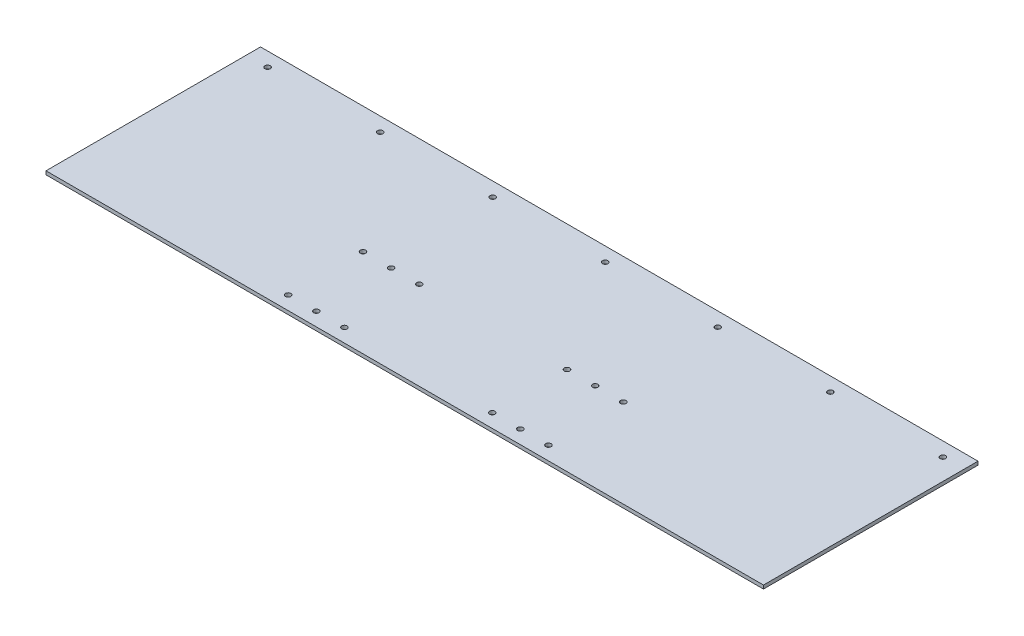
ISO-10303-21;
HEADER;
FILE_DESCRIPTION(('STEP AP214'),'2;1');
FILE_NAME('part.step','',(''),(''),'','','');
FILE_SCHEMA(('AUTOMOTIVE_DESIGN { 1 0 10303 214 1 1 1 1 }'));
ENDSEC;
DATA;
#1=APPLICATION_CONTEXT('core data for automotive mechanical design processes');
#2=APPLICATION_PROTOCOL_DEFINITION('international standard','automotive_design',2000,#1);
#3=PRODUCT_CONTEXT('',#1,'mechanical');
#4=PRODUCT('Part','Part','',(#3));
#5=PRODUCT_RELATED_PRODUCT_CATEGORY('part','',(#4));
#6=PRODUCT_DEFINITION_FORMATION('','',#4);
#7=PRODUCT_DEFINITION_CONTEXT('part definition',#1,'design');
#8=PRODUCT_DEFINITION('design','',#6,#7);
#9=PRODUCT_DEFINITION_SHAPE('','',#8);
#10=(LENGTH_UNIT() NAMED_UNIT(*) SI_UNIT(.MILLI.,.METRE.));
#11=(NAMED_UNIT(*) PLANE_ANGLE_UNIT() SI_UNIT($,.RADIAN.));
#12=(NAMED_UNIT(*) SI_UNIT($,.STERADIAN.) SOLID_ANGLE_UNIT());
#13=UNCERTAINTY_MEASURE_WITH_UNIT(LENGTH_MEASURE(1.E-05),#10,'distance_accuracy_value','');
#14=(GEOMETRIC_REPRESENTATION_CONTEXT(3) GLOBAL_UNCERTAINTY_ASSIGNED_CONTEXT((#13)) GLOBAL_UNIT_ASSIGNED_CONTEXT((#10,
#11,#12)) REPRESENTATION_CONTEXT('',''));
#15=CARTESIAN_POINT('',(0.,0.,0.));
#16=DIRECTION('',(0.,0.,1.));
#17=DIRECTION('',(1.,0.,0.));
#18=AXIS2_PLACEMENT_3D('',#15,#16,#17);
#19=CARTESIAN_POINT('',(0.,3.175,0.));
#20=DIRECTION('',(0.,-1.,0.));
#21=DIRECTION('',(0.,0.,-1.));
#22=AXIS2_PLACEMENT_3D('',#19,#20,#21);
#23=PLANE('',#22);
#24=DIRECTION('',(0.,0.,1.));
#25=VECTOR('',#24,1.);
#26=CARTESIAN_POINT('',(0.,3.175,0.));
#27=LINE('',#26,#25);
#28=CARTESIAN_POINT('',(0.,3.175,-193.675));
#29=VERTEX_POINT('',#28);
#30=CARTESIAN_POINT('',(0.,3.175,0.));
#31=VERTEX_POINT('',#30);
#32=EDGE_CURVE('E85',#29,#31,#27,.T.);
#33=ORIENTED_EDGE('',*,*,#32,.T.);
#34=DIRECTION('',(1.,0.,0.));
#35=VECTOR('',#34,1.);
#36=CARTESIAN_POINT('',(0.,3.175,0.));
#37=LINE('',#36,#35);
#38=CARTESIAN_POINT('',(647.7,3.175,0.));
#39=VERTEX_POINT('',#38);
#40=EDGE_CURVE('E80',#31,#39,#37,.T.);
#41=ORIENTED_EDGE('',*,*,#40,.T.);
#42=DIRECTION('',(0.,0.,-1.));
#43=VECTOR('',#42,1.);
#44=CARTESIAN_POINT('',(647.7,3.175,0.));
#45=LINE('',#44,#43);
#46=CARTESIAN_POINT('',(647.7,3.175,-193.675));
#47=VERTEX_POINT('',#46);
#48=EDGE_CURVE('E83',#39,#47,#45,.T.);
#49=ORIENTED_EDGE('',*,*,#48,.T.);
#50=DIRECTION('',(-1.,0.,0.));
#51=VECTOR('',#50,1.);
#52=CARTESIAN_POINT('',(0.,3.175,-193.675));
#53=LINE('',#52,#51);
#54=EDGE_CURVE('E50',#47,#29,#53,.T.);
#55=ORIENTED_EDGE('',*,*,#54,.T.);
#56=EDGE_LOOP('',(#33,#41,#49,#55));
#57=FACE_BOUND('',#56,.T.);
#58=CARTESIAN_POINT('',(231.775,3.175,-12.2555));
#59=DIRECTION('',(0.,1.,0.));
#60=DIRECTION('',(0.,0.,1.));
#61=AXIS2_PLACEMENT_3D('',#58,#59,#60);
#62=CIRCLE('',#61,2.4257);
#63=CARTESIAN_POINT('',(231.775,3.175,-9.8298));
#64=VERTEX_POINT('',#63);
#65=EDGE_CURVE('E100',#64,#64,#62,.T.);
#66=ORIENTED_EDGE('',*,*,#65,.F.);
#67=EDGE_LOOP('',(#66));
#68=FACE_BOUND('',#67,.T.);
#69=CARTESIAN_POINT('',(257.175,3.175,-12.2555));
#70=DIRECTION('',(0.,1.,0.));
#71=DIRECTION('',(0.,0.,1.));
#72=AXIS2_PLACEMENT_3D('',#69,#70,#71);
#73=CIRCLE('',#72,2.42569999999997);
#74=CARTESIAN_POINT('',(257.175,3.175,-9.82980000000003));
#75=VERTEX_POINT('',#74);
#76=EDGE_CURVE('E115',#75,#75,#73,.T.);
#77=ORIENTED_EDGE('',*,*,#76,.F.);
#78=EDGE_LOOP('',(#77));
#79=FACE_BOUND('',#78,.T.);
#80=CARTESIAN_POINT('',(206.375,3.175,-12.2555));
#81=DIRECTION('',(0.,1.,0.));
#82=DIRECTION('',(0.,0.,-1.));
#83=AXIS2_PLACEMENT_3D('',#80,#81,#82);
#84=CIRCLE('',#83,2.42569999999997);
#85=CARTESIAN_POINT('',(206.375,3.175,-14.6812));
#86=VERTEX_POINT('',#85);
#87=EDGE_CURVE('E121',#86,#86,#84,.T.);
#88=ORIENTED_EDGE('',*,*,#87,.F.);
#89=EDGE_LOOP('',(#88));
#90=FACE_BOUND('',#89,.T.);
#91=CARTESIAN_POINT('',(257.175,3.175,-79.8195));
#92=DIRECTION('',(0.,1.,0.));
#93=DIRECTION('',(0.,0.,-1.));
#94=AXIS2_PLACEMENT_3D('',#91,#92,#93);
#95=CIRCLE('',#94,2.42569999999997);
#96=CARTESIAN_POINT('',(257.175,3.175,-82.2452));
#97=VERTEX_POINT('',#96);
#98=EDGE_CURVE('E127',#97,#97,#95,.T.);
#99=ORIENTED_EDGE('',*,*,#98,.F.);
#100=EDGE_LOOP('',(#99));
#101=FACE_BOUND('',#100,.T.);
#102=CARTESIAN_POINT('',(231.775,3.175,-79.8195));
#103=DIRECTION('',(0.,1.,0.));
#104=DIRECTION('',(0.,0.,-1.));
#105=AXIS2_PLACEMENT_3D('',#102,#103,#104);
#106=CIRCLE('',#105,2.4257);
#107=CARTESIAN_POINT('',(231.775,3.175,-82.2452));
#108=VERTEX_POINT('',#107);
#109=EDGE_CURVE('E133',#108,#108,#106,.T.);
#110=ORIENTED_EDGE('',*,*,#109,.F.);
#111=EDGE_LOOP('',(#110));
#112=FACE_BOUND('',#111,.T.);
#113=CARTESIAN_POINT('',(206.375,3.175,-79.8195));
#114=DIRECTION('',(0.,1.,0.));
#115=DIRECTION('',(0.,0.,1.));
#116=AXIS2_PLACEMENT_3D('',#113,#114,#115);
#117=CIRCLE('',#116,2.42569999999997);
#118=CARTESIAN_POINT('',(206.375,3.175,-77.3938));
#119=VERTEX_POINT('',#118);
#120=EDGE_CURVE('E139',#119,#119,#117,.T.);
#121=ORIENTED_EDGE('',*,*,#120,.F.);
#122=EDGE_LOOP('',(#121));
#123=FACE_BOUND('',#122,.T.);
#124=CARTESIAN_POINT('',(323.85,3.175,-180.975));
#125=DIRECTION('',(0.,1.,0.));
#126=DIRECTION('',(0.,0.,1.));
#127=AXIS2_PLACEMENT_3D('',#124,#125,#126);
#128=CIRCLE('',#127,2.42569999999997);
#129=CARTESIAN_POINT('',(323.85,3.175,-178.5493));
#130=VERTEX_POINT('',#129);
#131=EDGE_CURVE('E145',#130,#130,#128,.T.);
#132=ORIENTED_EDGE('',*,*,#131,.F.);
#133=EDGE_LOOP('',(#132));
#134=FACE_BOUND('',#133,.T.);
#135=CARTESIAN_POINT('',(425.45,3.175,-180.975));
#136=DIRECTION('',(0.,1.,0.));
#137=DIRECTION('',(0.,0.,1.));
#138=AXIS2_PLACEMENT_3D('',#135,#136,#137);
#139=CIRCLE('',#138,2.42569999999997);
#140=CARTESIAN_POINT('',(425.45,3.175,-178.5493));
#141=VERTEX_POINT('',#140);
#142=EDGE_CURVE('E151',#141,#141,#139,.T.);
#143=ORIENTED_EDGE('',*,*,#142,.F.);
#144=EDGE_LOOP('',(#143));
#145=FACE_BOUND('',#144,.T.);
#146=CARTESIAN_POINT('',(527.05,3.175,-180.975));
#147=DIRECTION('',(0.,1.,0.));
#148=DIRECTION('',(0.,0.,1.));
#149=AXIS2_PLACEMENT_3D('',#146,#147,#148);
#150=CIRCLE('',#149,2.42569999999997);
#151=CARTESIAN_POINT('',(527.05,3.175,-178.5493));
#152=VERTEX_POINT('',#151);
#153=EDGE_CURVE('E157',#152,#152,#150,.T.);
#154=ORIENTED_EDGE('',*,*,#153,.F.);
#155=EDGE_LOOP('',(#154));
#156=FACE_BOUND('',#155,.T.);
#157=CARTESIAN_POINT('',(628.65,3.175,-180.975));
#158=DIRECTION('',(0.,1.,0.));
#159=DIRECTION('',(0.,0.,1.));
#160=AXIS2_PLACEMENT_3D('',#157,#158,#159);
#161=CIRCLE('',#160,2.42569999999997);
#162=CARTESIAN_POINT('',(628.65,3.175,-178.5493));
#163=VERTEX_POINT('',#162);
#164=EDGE_CURVE('E163',#163,#163,#161,.T.);
#165=ORIENTED_EDGE('',*,*,#164,.F.);
#166=EDGE_LOOP('',(#165));
#167=FACE_BOUND('',#166,.T.);
#168=CARTESIAN_POINT('',(120.65,3.175,-180.975));
#169=DIRECTION('',(0.,1.,0.));
#170=DIRECTION('',(0.,0.,-1.));
#171=AXIS2_PLACEMENT_3D('',#168,#169,#170);
#172=CIRCLE('',#171,2.42569999999998);
#173=CARTESIAN_POINT('',(120.65,3.175,-183.4007));
#174=VERTEX_POINT('',#173);
#175=EDGE_CURVE('E169',#174,#174,#172,.T.);
#176=ORIENTED_EDGE('',*,*,#175,.F.);
#177=EDGE_LOOP('',(#176));
#178=FACE_BOUND('',#177,.T.);
#179=CARTESIAN_POINT('',(222.25,3.175,-180.975));
#180=DIRECTION('',(0.,1.,0.));
#181=DIRECTION('',(0.,0.,-1.));
#182=AXIS2_PLACEMENT_3D('',#179,#180,#181);
#183=CIRCLE('',#182,2.42569999999997);
#184=CARTESIAN_POINT('',(222.25,3.175,-183.4007));
#185=VERTEX_POINT('',#184);
#186=EDGE_CURVE('E175',#185,#185,#183,.T.);
#187=ORIENTED_EDGE('',*,*,#186,.F.);
#188=EDGE_LOOP('',(#187));
#189=FACE_BOUND('',#188,.T.);
#190=CARTESIAN_POINT('',(19.05,3.175,-180.975));
#191=DIRECTION('',(0.,1.,0.));
#192=DIRECTION('',(0.,0.,-1.));
#193=AXIS2_PLACEMENT_3D('',#190,#191,#192);
#194=CIRCLE('',#193,2.42569999999997);
#195=CARTESIAN_POINT('',(19.05,3.175,-183.4007));
#196=VERTEX_POINT('',#195);
#197=EDGE_CURVE('E181',#196,#196,#194,.T.);
#198=ORIENTED_EDGE('',*,*,#197,.F.);
#199=EDGE_LOOP('',(#198));
#200=FACE_BOUND('',#199,.T.);
#201=CARTESIAN_POINT('',(441.325,3.175,-79.8195));
#202=DIRECTION('',(0.,1.,0.));
#203=DIRECTION('',(0.,0.,-1.));
#204=AXIS2_PLACEMENT_3D('',#201,#202,#203);
#205=CIRCLE('',#204,2.42569999999997);
#206=CARTESIAN_POINT('',(441.325,3.175,-82.2452));
#207=VERTEX_POINT('',#206);
#208=EDGE_CURVE('E187',#207,#207,#205,.T.);
#209=ORIENTED_EDGE('',*,*,#208,.F.);
#210=EDGE_LOOP('',(#209));
#211=FACE_BOUND('',#210,.T.);
#212=CARTESIAN_POINT('',(415.925,3.175,-79.8195));
#213=DIRECTION('',(0.,1.,0.));
#214=DIRECTION('',(0.,0.,1.));
#215=AXIS2_PLACEMENT_3D('',#212,#213,#214);
#216=CIRCLE('',#215,2.42569999999997);
#217=CARTESIAN_POINT('',(415.925,3.175,-77.3938));
#218=VERTEX_POINT('',#217);
#219=EDGE_CURVE('E193',#218,#218,#216,.T.);
#220=ORIENTED_EDGE('',*,*,#219,.F.);
#221=EDGE_LOOP('',(#220));
#222=FACE_BOUND('',#221,.T.);
#223=CARTESIAN_POINT('',(390.525,3.175,-79.8195));
#224=DIRECTION('',(0.,1.,0.));
#225=DIRECTION('',(0.,0.,1.));
#226=AXIS2_PLACEMENT_3D('',#223,#224,#225);
#227=CIRCLE('',#226,2.42569999999997);
#228=CARTESIAN_POINT('',(390.525,3.175,-77.3938));
#229=VERTEX_POINT('',#228);
#230=EDGE_CURVE('E199',#229,#229,#227,.T.);
#231=ORIENTED_EDGE('',*,*,#230,.F.);
#232=EDGE_LOOP('',(#231));
#233=FACE_BOUND('',#232,.T.);
#234=CARTESIAN_POINT('',(441.325,3.175,-12.2555));
#235=DIRECTION('',(0.,1.,0.));
#236=DIRECTION('',(0.,0.,1.));
#237=AXIS2_PLACEMENT_3D('',#234,#235,#236);
#238=CIRCLE('',#237,2.42569999999997);
#239=CARTESIAN_POINT('',(441.325,3.175,-9.82980000000003));
#240=VERTEX_POINT('',#239);
#241=EDGE_CURVE('E205',#240,#240,#238,.T.);
#242=ORIENTED_EDGE('',*,*,#241,.F.);
#243=EDGE_LOOP('',(#242));
#244=FACE_BOUND('',#243,.T.);
#245=CARTESIAN_POINT('',(390.525,3.175,-12.2555));
#246=DIRECTION('',(0.,1.,0.));
#247=DIRECTION('',(0.,0.,-1.));
#248=AXIS2_PLACEMENT_3D('',#245,#246,#247);
#249=CIRCLE('',#248,2.42569999999997);
#250=CARTESIAN_POINT('',(390.525,3.175,-14.6812));
#251=VERTEX_POINT('',#250);
#252=EDGE_CURVE('E211',#251,#251,#249,.T.);
#253=ORIENTED_EDGE('',*,*,#252,.F.);
#254=EDGE_LOOP('',(#253));
#255=FACE_BOUND('',#254,.T.);
#256=CARTESIAN_POINT('',(415.925,3.175,-12.2555));
#257=DIRECTION('',(0.,1.,0.));
#258=DIRECTION('',(0.,0.,-1.));
#259=AXIS2_PLACEMENT_3D('',#256,#257,#258);
#260=CIRCLE('',#259,2.42569999999997);
#261=CARTESIAN_POINT('',(415.925,3.175,-14.6812));
#262=VERTEX_POINT('',#261);
#263=EDGE_CURVE('E217',#262,#262,#260,.T.);
#264=ORIENTED_EDGE('',*,*,#263,.F.);
#265=EDGE_LOOP('',(#264));
#266=FACE_BOUND('',#265,.T.);
#267=ADVANCED_FACE('F33',(#57,#68,#79,#90,#101,#112,#123,#134,#145,#156,#167,#178,#189,#200,
#211,#222,#233,#244,#255,#266),#23,.F.);
#268=CARTESIAN_POINT('',(0.,0.,0.));
#269=DIRECTION('',(0.,-1.,0.));
#270=DIRECTION('',(0.,0.,-1.));
#271=AXIS2_PLACEMENT_3D('',#268,#269,#270);
#272=PLANE('',#271);
#273=CARTESIAN_POINT('',(390.525,0.,-12.2555));
#274=DIRECTION('',(0.,1.,0.));
#275=DIRECTION('',(0.,0.,-1.));
#276=AXIS2_PLACEMENT_3D('',#273,#274,#275);
#277=CIRCLE('',#276,2.42569999999997);
#278=CARTESIAN_POINT('',(390.525,0.,-14.6812));
#279=VERTEX_POINT('',#278);
#280=EDGE_CURVE('E214',#279,#279,#277,.T.);
#281=ORIENTED_EDGE('',*,*,#280,.T.);
#282=EDGE_LOOP('',(#281));
#283=FACE_BOUND('',#282,.T.);
#284=CARTESIAN_POINT('',(390.525,0.,-79.8195));
#285=DIRECTION('',(0.,1.,0.));
#286=DIRECTION('',(0.,0.,1.));
#287=AXIS2_PLACEMENT_3D('',#284,#285,#286);
#288=CIRCLE('',#287,2.42569999999997);
#289=CARTESIAN_POINT('',(390.525,0.,-77.3938));
#290=VERTEX_POINT('',#289);
#291=EDGE_CURVE('E202',#290,#290,#288,.T.);
#292=ORIENTED_EDGE('',*,*,#291,.T.);
#293=EDGE_LOOP('',(#292));
#294=FACE_BOUND('',#293,.T.);
#295=CARTESIAN_POINT('',(441.325,0.,-79.8195));
#296=DIRECTION('',(0.,1.,0.));
#297=DIRECTION('',(0.,0.,-1.));
#298=AXIS2_PLACEMENT_3D('',#295,#296,#297);
#299=CIRCLE('',#298,2.42569999999997);
#300=CARTESIAN_POINT('',(441.325,0.,-82.2452));
#301=VERTEX_POINT('',#300);
#302=EDGE_CURVE('E190',#301,#301,#299,.T.);
#303=ORIENTED_EDGE('',*,*,#302,.T.);
#304=EDGE_LOOP('',(#303));
#305=FACE_BOUND('',#304,.T.);
#306=CARTESIAN_POINT('',(222.25,0.,-180.975));
#307=DIRECTION('',(0.,1.,0.));
#308=DIRECTION('',(0.,0.,-1.));
#309=AXIS2_PLACEMENT_3D('',#306,#307,#308);
#310=CIRCLE('',#309,2.42569999999997);
#311=CARTESIAN_POINT('',(222.25,0.,-183.4007));
#312=VERTEX_POINT('',#311);
#313=EDGE_CURVE('E178',#312,#312,#310,.T.);
#314=ORIENTED_EDGE('',*,*,#313,.T.);
#315=EDGE_LOOP('',(#314));
#316=FACE_BOUND('',#315,.T.);
#317=CARTESIAN_POINT('',(628.65,0.,-180.975));
#318=DIRECTION('',(0.,1.,0.));
#319=DIRECTION('',(0.,0.,1.));
#320=AXIS2_PLACEMENT_3D('',#317,#318,#319);
#321=CIRCLE('',#320,2.42569999999997);
#322=CARTESIAN_POINT('',(628.65,0.,-178.5493));
#323=VERTEX_POINT('',#322);
#324=EDGE_CURVE('E166',#323,#323,#321,.T.);
#325=ORIENTED_EDGE('',*,*,#324,.T.);
#326=EDGE_LOOP('',(#325));
#327=FACE_BOUND('',#326,.T.);
#328=CARTESIAN_POINT('',(425.45,0.,-180.975));
#329=DIRECTION('',(0.,1.,0.));
#330=DIRECTION('',(0.,0.,1.));
#331=AXIS2_PLACEMENT_3D('',#328,#329,#330);
#332=CIRCLE('',#331,2.42569999999997);
#333=CARTESIAN_POINT('',(425.45,0.,-178.5493));
#334=VERTEX_POINT('',#333);
#335=EDGE_CURVE('E154',#334,#334,#332,.T.);
#336=ORIENTED_EDGE('',*,*,#335,.T.);
#337=EDGE_LOOP('',(#336));
#338=FACE_BOUND('',#337,.T.);
#339=CARTESIAN_POINT('',(206.375,0.,-79.8195));
#340=DIRECTION('',(0.,1.,0.));
#341=DIRECTION('',(0.,0.,1.));
#342=AXIS2_PLACEMENT_3D('',#339,#340,#341);
#343=CIRCLE('',#342,2.42569999999997);
#344=CARTESIAN_POINT('',(206.375,0.,-77.3938));
#345=VERTEX_POINT('',#344);
#346=EDGE_CURVE('E142',#345,#345,#343,.T.);
#347=ORIENTED_EDGE('',*,*,#346,.T.);
#348=EDGE_LOOP('',(#347));
#349=FACE_BOUND('',#348,.T.);
#350=CARTESIAN_POINT('',(257.175,0.,-79.8195));
#351=DIRECTION('',(0.,1.,0.));
#352=DIRECTION('',(0.,0.,-1.));
#353=AXIS2_PLACEMENT_3D('',#350,#351,#352);
#354=CIRCLE('',#353,2.42569999999997);
#355=CARTESIAN_POINT('',(257.175,0.,-82.2452));
#356=VERTEX_POINT('',#355);
#357=EDGE_CURVE('E130',#356,#356,#354,.T.);
#358=ORIENTED_EDGE('',*,*,#357,.T.);
#359=EDGE_LOOP('',(#358));
#360=FACE_BOUND('',#359,.T.);
#361=CARTESIAN_POINT('',(257.175,0.,-12.2555));
#362=DIRECTION('',(0.,1.,0.));
#363=DIRECTION('',(0.,0.,1.));
#364=AXIS2_PLACEMENT_3D('',#361,#362,#363);
#365=CIRCLE('',#364,2.42569999999997);
#366=CARTESIAN_POINT('',(257.175,0.,-9.82980000000003));
#367=VERTEX_POINT('',#366);
#368=EDGE_CURVE('E118',#367,#367,#365,.T.);
#369=ORIENTED_EDGE('',*,*,#368,.T.);
#370=EDGE_LOOP('',(#369));
#371=FACE_BOUND('',#370,.T.);
#372=DIRECTION('',(0.,0.,1.));
#373=VECTOR('',#372,1.);
#374=CARTESIAN_POINT('',(0.,0.,0.));
#375=LINE('',#374,#373);
#376=CARTESIAN_POINT('',(0.,0.,-193.675));
#377=VERTEX_POINT('',#376);
#378=CARTESIAN_POINT('',(0.,0.,0.));
#379=VERTEX_POINT('',#378);
#380=EDGE_CURVE('E97',#377,#379,#375,.T.);
#381=ORIENTED_EDGE('',*,*,#380,.F.);
#382=DIRECTION('',(-1.,0.,0.));
#383=VECTOR('',#382,1.);
#384=CARTESIAN_POINT('',(0.,0.,-193.675));
#385=LINE('',#384,#383);
#386=CARTESIAN_POINT('',(647.7,0.,-193.675));
#387=VERTEX_POINT('',#386);
#388=EDGE_CURVE('E73',#387,#377,#385,.T.);
#389=ORIENTED_EDGE('',*,*,#388,.F.);
#390=DIRECTION('',(0.,0.,-1.));
#391=VECTOR('',#390,1.);
#392=CARTESIAN_POINT('',(647.7,0.,0.));
#393=LINE('',#392,#391);
#394=CARTESIAN_POINT('',(647.7,0.,0.));
#395=VERTEX_POINT('',#394);
#396=EDGE_CURVE('E67',#395,#387,#393,.T.);
#397=ORIENTED_EDGE('',*,*,#396,.F.);
#398=DIRECTION('',(1.,0.,0.));
#399=VECTOR('',#398,1.);
#400=CARTESIAN_POINT('',(0.,0.,0.));
#401=LINE('',#400,#399);
#402=EDGE_CURVE('E89',#379,#395,#401,.T.);
#403=ORIENTED_EDGE('',*,*,#402,.F.);
#404=EDGE_LOOP('',(#381,#389,#397,#403));
#405=FACE_BOUND('',#404,.T.);
#406=CARTESIAN_POINT('',(231.775,0.,-12.2555));
#407=DIRECTION('',(0.,1.,0.));
#408=DIRECTION('',(0.,0.,1.));
#409=AXIS2_PLACEMENT_3D('',#406,#407,#408);
#410=CIRCLE('',#409,2.4257);
#411=CARTESIAN_POINT('',(231.775,0.,-9.8298));
#412=VERTEX_POINT('',#411);
#413=EDGE_CURVE('E112',#412,#412,#410,.T.);
#414=ORIENTED_EDGE('',*,*,#413,.T.);
#415=EDGE_LOOP('',(#414));
#416=FACE_BOUND('',#415,.T.);
#417=CARTESIAN_POINT('',(206.375,0.,-12.2555));
#418=DIRECTION('',(0.,1.,0.));
#419=DIRECTION('',(0.,0.,-1.));
#420=AXIS2_PLACEMENT_3D('',#417,#418,#419);
#421=CIRCLE('',#420,2.42569999999997);
#422=CARTESIAN_POINT('',(206.375,0.,-14.6812));
#423=VERTEX_POINT('',#422);
#424=EDGE_CURVE('E124',#423,#423,#421,.T.);
#425=ORIENTED_EDGE('',*,*,#424,.T.);
#426=EDGE_LOOP('',(#425));
#427=FACE_BOUND('',#426,.T.);
#428=CARTESIAN_POINT('',(231.775,0.,-79.8195));
#429=DIRECTION('',(0.,1.,0.));
#430=DIRECTION('',(0.,0.,-1.));
#431=AXIS2_PLACEMENT_3D('',#428,#429,#430);
#432=CIRCLE('',#431,2.4257);
#433=CARTESIAN_POINT('',(231.775,0.,-82.2452));
#434=VERTEX_POINT('',#433);
#435=EDGE_CURVE('E136',#434,#434,#432,.T.);
#436=ORIENTED_EDGE('',*,*,#435,.T.);
#437=EDGE_LOOP('',(#436));
#438=FACE_BOUND('',#437,.T.);
#439=CARTESIAN_POINT('',(323.85,0.,-180.975));
#440=DIRECTION('',(0.,1.,0.));
#441=DIRECTION('',(0.,0.,1.));
#442=AXIS2_PLACEMENT_3D('',#439,#440,#441);
#443=CIRCLE('',#442,2.42569999999997);
#444=CARTESIAN_POINT('',(323.85,0.,-178.5493));
#445=VERTEX_POINT('',#444);
#446=EDGE_CURVE('E148',#445,#445,#443,.T.);
#447=ORIENTED_EDGE('',*,*,#446,.T.);
#448=EDGE_LOOP('',(#447));
#449=FACE_BOUND('',#448,.T.);
#450=CARTESIAN_POINT('',(527.05,0.,-180.975));
#451=DIRECTION('',(0.,1.,0.));
#452=DIRECTION('',(0.,0.,1.));
#453=AXIS2_PLACEMENT_3D('',#450,#451,#452);
#454=CIRCLE('',#453,2.42569999999997);
#455=CARTESIAN_POINT('',(527.05,0.,-178.5493));
#456=VERTEX_POINT('',#455);
#457=EDGE_CURVE('E160',#456,#456,#454,.T.);
#458=ORIENTED_EDGE('',*,*,#457,.T.);
#459=EDGE_LOOP('',(#458));
#460=FACE_BOUND('',#459,.T.);
#461=CARTESIAN_POINT('',(120.65,0.,-180.975));
#462=DIRECTION('',(0.,1.,0.));
#463=DIRECTION('',(0.,0.,-1.));
#464=AXIS2_PLACEMENT_3D('',#461,#462,#463);
#465=CIRCLE('',#464,2.42569999999998);
#466=CARTESIAN_POINT('',(120.65,0.,-183.4007));
#467=VERTEX_POINT('',#466);
#468=EDGE_CURVE('E172',#467,#467,#465,.T.);
#469=ORIENTED_EDGE('',*,*,#468,.T.);
#470=EDGE_LOOP('',(#469));
#471=FACE_BOUND('',#470,.T.);
#472=CARTESIAN_POINT('',(19.05,0.,-180.975));
#473=DIRECTION('',(0.,1.,0.));
#474=DIRECTION('',(0.,0.,-1.));
#475=AXIS2_PLACEMENT_3D('',#472,#473,#474);
#476=CIRCLE('',#475,2.42569999999997);
#477=CARTESIAN_POINT('',(19.05,0.,-183.4007));
#478=VERTEX_POINT('',#477);
#479=EDGE_CURVE('E184',#478,#478,#476,.T.);
#480=ORIENTED_EDGE('',*,*,#479,.T.);
#481=EDGE_LOOP('',(#480));
#482=FACE_BOUND('',#481,.T.);
#483=CARTESIAN_POINT('',(415.925,0.,-79.8195));
#484=DIRECTION('',(0.,1.,0.));
#485=DIRECTION('',(0.,0.,1.));
#486=AXIS2_PLACEMENT_3D('',#483,#484,#485);
#487=CIRCLE('',#486,2.42569999999997);
#488=CARTESIAN_POINT('',(415.925,0.,-77.3938));
#489=VERTEX_POINT('',#488);
#490=EDGE_CURVE('E196',#489,#489,#487,.T.);
#491=ORIENTED_EDGE('',*,*,#490,.T.);
#492=EDGE_LOOP('',(#491));
#493=FACE_BOUND('',#492,.T.);
#494=CARTESIAN_POINT('',(441.325,0.,-12.2555));
#495=DIRECTION('',(0.,1.,0.));
#496=DIRECTION('',(0.,0.,1.));
#497=AXIS2_PLACEMENT_3D('',#494,#495,#496);
#498=CIRCLE('',#497,2.42569999999997);
#499=CARTESIAN_POINT('',(441.325,0.,-9.82980000000003));
#500=VERTEX_POINT('',#499);
#501=EDGE_CURVE('E208',#500,#500,#498,.T.);
#502=ORIENTED_EDGE('',*,*,#501,.T.);
#503=EDGE_LOOP('',(#502));
#504=FACE_BOUND('',#503,.T.);
#505=CARTESIAN_POINT('',(415.925,0.,-12.2555));
#506=DIRECTION('',(0.,1.,0.));
#507=DIRECTION('',(0.,0.,-1.));
#508=AXIS2_PLACEMENT_3D('',#505,#506,#507);
#509=CIRCLE('',#508,2.42569999999997);
#510=CARTESIAN_POINT('',(415.925,0.,-14.6812));
#511=VERTEX_POINT('',#510);
#512=EDGE_CURVE('E220',#511,#511,#509,.T.);
#513=ORIENTED_EDGE('',*,*,#512,.T.);
#514=EDGE_LOOP('',(#513));
#515=FACE_BOUND('',#514,.T.);
#516=ADVANCED_FACE('F108',(#283,#294,#305,#316,#327,#338,#349,#360,#371,#405,#416,#427,#438,
#449,#460,#471,#482,#493,#504,#515),#272,.T.);
#517=CARTESIAN_POINT('',(0.,3.175,0.));
#518=DIRECTION('',(1.,0.,0.));
#519=DIRECTION('',(0.,0.,-1.));
#520=AXIS2_PLACEMENT_3D('',#517,#518,#519);
#521=PLANE('',#520);
#522=ORIENTED_EDGE('',*,*,#380,.T.);
#523=DIRECTION('',(0.,-1.,0.));
#524=VECTOR('',#523,1.);
#525=CARTESIAN_POINT('',(0.,3.175,0.));
#526=LINE('',#525,#524);
#527=EDGE_CURVE('E11',#31,#379,#526,.T.);
#528=ORIENTED_EDGE('',*,*,#527,.F.);
#529=ORIENTED_EDGE('',*,*,#32,.F.);
#530=DIRECTION('',(0.,-1.,0.));
#531=VECTOR('',#530,1.);
#532=CARTESIAN_POINT('',(0.,3.175,-193.675));
#533=LINE('',#532,#531);
#534=EDGE_CURVE('E93',#29,#377,#533,.T.);
#535=ORIENTED_EDGE('',*,*,#534,.T.);
#536=EDGE_LOOP('',(#522,#528,#529,#535));
#537=FACE_BOUND('',#536,.T.);
#538=ADVANCED_FACE('F35',(#537),#521,.F.);
#539=CARTESIAN_POINT('',(0.,3.175,0.));
#540=DIRECTION('',(0.,0.,-1.));
#541=DIRECTION('',(-1.,0.,0.));
#542=AXIS2_PLACEMENT_3D('',#539,#540,#541);
#543=PLANE('',#542);
#544=ORIENTED_EDGE('',*,*,#402,.T.);
#545=DIRECTION('',(0.,-1.,0.));
#546=VECTOR('',#545,1.);
#547=CARTESIAN_POINT('',(647.7,3.175,0.));
#548=LINE('',#547,#546);
#549=EDGE_CURVE('E42',#39,#395,#548,.T.);
#550=ORIENTED_EDGE('',*,*,#549,.F.);
#551=ORIENTED_EDGE('',*,*,#40,.F.);
#552=ORIENTED_EDGE('',*,*,#527,.T.);
#553=EDGE_LOOP('',(#544,#550,#551,#552));
#554=FACE_BOUND('',#553,.T.);
#555=ADVANCED_FACE('F88',(#554),#543,.F.);
#556=CARTESIAN_POINT('',(647.7,3.175,0.));
#557=DIRECTION('',(-1.,0.,0.));
#558=DIRECTION('',(0.,0.,1.));
#559=AXIS2_PLACEMENT_3D('',#556,#557,#558);
#560=PLANE('',#559);
#561=ORIENTED_EDGE('',*,*,#396,.T.);
#562=DIRECTION('',(0.,-1.,0.));
#563=VECTOR('',#562,1.);
#564=CARTESIAN_POINT('',(647.7,3.175,-193.675));
#565=LINE('',#564,#563);
#566=EDGE_CURVE('E90',#47,#387,#565,.T.);
#567=ORIENTED_EDGE('',*,*,#566,.F.);
#568=ORIENTED_EDGE('',*,*,#48,.F.);
#569=ORIENTED_EDGE('',*,*,#549,.T.);
#570=EDGE_LOOP('',(#561,#567,#568,#569));
#571=FACE_BOUND('',#570,.T.);
#572=ADVANCED_FACE('F91',(#571),#560,.F.);
#573=CARTESIAN_POINT('',(0.,3.175,-193.675));
#574=DIRECTION('',(0.,0.,1.));
#575=DIRECTION('',(1.,0.,0.));
#576=AXIS2_PLACEMENT_3D('',#573,#574,#575);
#577=PLANE('',#576);
#578=ORIENTED_EDGE('',*,*,#388,.T.);
#579=ORIENTED_EDGE('',*,*,#534,.F.);
#580=ORIENTED_EDGE('',*,*,#54,.F.);
#581=ORIENTED_EDGE('',*,*,#566,.T.);
#582=EDGE_LOOP('',(#578,#579,#580,#581));
#583=FACE_BOUND('',#582,.T.);
#584=ADVANCED_FACE('F105',(#583),#577,.F.);
#585=CARTESIAN_POINT('',(231.775,3.175,-12.2555));
#586=DIRECTION('',(0.,-1.,0.));
#587=DIRECTION('',(0.,0.,-1.));
#588=AXIS2_PLACEMENT_3D('',#585,#586,#587);
#589=CYLINDRICAL_SURFACE('',#588,2.4257);
#590=ORIENTED_EDGE('',*,*,#65,.T.);
#591=EDGE_LOOP('',(#590));
#592=FACE_BOUND('',#591,.T.);
#593=ORIENTED_EDGE('',*,*,#413,.F.);
#594=EDGE_LOOP('',(#593));
#595=FACE_BOUND('',#594,.T.);
#596=ADVANCED_FACE('F237',(#592,#595),#589,.F.);
#597=CARTESIAN_POINT('',(257.175,3.175,-12.2555));
#598=DIRECTION('',(0.,-1.,0.));
#599=DIRECTION('',(0.,0.,-1.));
#600=AXIS2_PLACEMENT_3D('',#597,#598,#599);
#601=CYLINDRICAL_SURFACE('',#600,2.42569999999997);
#602=ORIENTED_EDGE('',*,*,#76,.T.);
#603=EDGE_LOOP('',(#602));
#604=FACE_BOUND('',#603,.T.);
#605=ORIENTED_EDGE('',*,*,#368,.F.);
#606=EDGE_LOOP('',(#605));
#607=FACE_BOUND('',#606,.T.);
#608=ADVANCED_FACE('F283',(#604,#607),#601,.F.);
#609=CARTESIAN_POINT('',(206.375,3.175,-12.2555));
#610=DIRECTION('',(0.,-1.,0.));
#611=DIRECTION('',(0.,0.,-1.));
#612=AXIS2_PLACEMENT_3D('',#609,#610,#611);
#613=CYLINDRICAL_SURFACE('',#612,2.42569999999997);
#614=ORIENTED_EDGE('',*,*,#87,.T.);
#615=EDGE_LOOP('',(#614));
#616=FACE_BOUND('',#615,.T.);
#617=ORIENTED_EDGE('',*,*,#424,.F.);
#618=EDGE_LOOP('',(#617));
#619=FACE_BOUND('',#618,.T.);
#620=ADVANCED_FACE('F291',(#616,#619),#613,.F.);
#621=CARTESIAN_POINT('',(257.175,3.175,-79.8195));
#622=DIRECTION('',(0.,-1.,0.));
#623=DIRECTION('',(0.,0.,-1.));
#624=AXIS2_PLACEMENT_3D('',#621,#622,#623);
#625=CYLINDRICAL_SURFACE('',#624,2.42569999999997);
#626=ORIENTED_EDGE('',*,*,#98,.T.);
#627=EDGE_LOOP('',(#626));
#628=FACE_BOUND('',#627,.T.);
#629=ORIENTED_EDGE('',*,*,#357,.F.);
#630=EDGE_LOOP('',(#629));
#631=FACE_BOUND('',#630,.T.);
#632=ADVANCED_FACE('F299',(#628,#631),#625,.F.);
#633=CARTESIAN_POINT('',(231.775,3.175,-79.8195));
#634=DIRECTION('',(0.,-1.,0.));
#635=DIRECTION('',(0.,0.,-1.));
#636=AXIS2_PLACEMENT_3D('',#633,#634,#635);
#637=CYLINDRICAL_SURFACE('',#636,2.4257);
#638=ORIENTED_EDGE('',*,*,#109,.T.);
#639=EDGE_LOOP('',(#638));
#640=FACE_BOUND('',#639,.T.);
#641=ORIENTED_EDGE('',*,*,#435,.F.);
#642=EDGE_LOOP('',(#641));
#643=FACE_BOUND('',#642,.T.);
#644=ADVANCED_FACE('F308',(#640,#643),#637,.F.);
#645=CARTESIAN_POINT('',(206.375,3.175,-79.8195));
#646=DIRECTION('',(0.,-1.,0.));
#647=DIRECTION('',(0.,0.,-1.));
#648=AXIS2_PLACEMENT_3D('',#645,#646,#647);
#649=CYLINDRICAL_SURFACE('',#648,2.42569999999997);
#650=ORIENTED_EDGE('',*,*,#120,.T.);
#651=EDGE_LOOP('',(#650));
#652=FACE_BOUND('',#651,.T.);
#653=ORIENTED_EDGE('',*,*,#346,.F.);
#654=EDGE_LOOP('',(#653));
#655=FACE_BOUND('',#654,.T.);
#656=ADVANCED_FACE('F317',(#652,#655),#649,.F.);
#657=CARTESIAN_POINT('',(323.85,3.175,-180.975));
#658=DIRECTION('',(0.,-1.,0.));
#659=DIRECTION('',(0.,0.,-1.));
#660=AXIS2_PLACEMENT_3D('',#657,#658,#659);
#661=CYLINDRICAL_SURFACE('',#660,2.42569999999997);
#662=ORIENTED_EDGE('',*,*,#131,.T.);
#663=EDGE_LOOP('',(#662));
#664=FACE_BOUND('',#663,.T.);
#665=ORIENTED_EDGE('',*,*,#446,.F.);
#666=EDGE_LOOP('',(#665));
#667=FACE_BOUND('',#666,.T.);
#668=ADVANCED_FACE('F326',(#664,#667),#661,.F.);
#669=CARTESIAN_POINT('',(425.45,3.175,-180.975));
#670=DIRECTION('',(0.,-1.,0.));
#671=DIRECTION('',(0.,0.,-1.));
#672=AXIS2_PLACEMENT_3D('',#669,#670,#671);
#673=CYLINDRICAL_SURFACE('',#672,2.42569999999997);
#674=ORIENTED_EDGE('',*,*,#142,.T.);
#675=EDGE_LOOP('',(#674));
#676=FACE_BOUND('',#675,.T.);
#677=ORIENTED_EDGE('',*,*,#335,.F.);
#678=EDGE_LOOP('',(#677));
#679=FACE_BOUND('',#678,.T.);
#680=ADVANCED_FACE('F335',(#676,#679),#673,.F.);
#681=CARTESIAN_POINT('',(527.05,3.175,-180.975));
#682=DIRECTION('',(0.,-1.,0.));
#683=DIRECTION('',(0.,0.,-1.));
#684=AXIS2_PLACEMENT_3D('',#681,#682,#683);
#685=CYLINDRICAL_SURFACE('',#684,2.42569999999997);
#686=ORIENTED_EDGE('',*,*,#153,.T.);
#687=EDGE_LOOP('',(#686));
#688=FACE_BOUND('',#687,.T.);
#689=ORIENTED_EDGE('',*,*,#457,.F.);
#690=EDGE_LOOP('',(#689));
#691=FACE_BOUND('',#690,.T.);
#692=ADVANCED_FACE('F344',(#688,#691),#685,.F.);
#693=CARTESIAN_POINT('',(628.65,3.175,-180.975));
#694=DIRECTION('',(0.,-1.,0.));
#695=DIRECTION('',(0.,0.,-1.));
#696=AXIS2_PLACEMENT_3D('',#693,#694,#695);
#697=CYLINDRICAL_SURFACE('',#696,2.42569999999997);
#698=ORIENTED_EDGE('',*,*,#164,.T.);
#699=EDGE_LOOP('',(#698));
#700=FACE_BOUND('',#699,.T.);
#701=ORIENTED_EDGE('',*,*,#324,.F.);
#702=EDGE_LOOP('',(#701));
#703=FACE_BOUND('',#702,.T.);
#704=ADVANCED_FACE('F353',(#700,#703),#697,.F.);
#705=CARTESIAN_POINT('',(120.65,3.175,-180.975));
#706=DIRECTION('',(0.,-1.,0.));
#707=DIRECTION('',(0.,0.,-1.));
#708=AXIS2_PLACEMENT_3D('',#705,#706,#707);
#709=CYLINDRICAL_SURFACE('',#708,2.42569999999998);
#710=ORIENTED_EDGE('',*,*,#175,.T.);
#711=EDGE_LOOP('',(#710));
#712=FACE_BOUND('',#711,.T.);
#713=ORIENTED_EDGE('',*,*,#468,.F.);
#714=EDGE_LOOP('',(#713));
#715=FACE_BOUND('',#714,.T.);
#716=ADVANCED_FACE('F362',(#712,#715),#709,.F.);
#717=CARTESIAN_POINT('',(222.25,3.175,-180.975));
#718=DIRECTION('',(0.,-1.,0.));
#719=DIRECTION('',(0.,0.,-1.));
#720=AXIS2_PLACEMENT_3D('',#717,#718,#719);
#721=CYLINDRICAL_SURFACE('',#720,2.42569999999997);
#722=ORIENTED_EDGE('',*,*,#186,.T.);
#723=EDGE_LOOP('',(#722));
#724=FACE_BOUND('',#723,.T.);
#725=ORIENTED_EDGE('',*,*,#313,.F.);
#726=EDGE_LOOP('',(#725));
#727=FACE_BOUND('',#726,.T.);
#728=ADVANCED_FACE('F371',(#724,#727),#721,.F.);
#729=CARTESIAN_POINT('',(19.05,3.175,-180.975));
#730=DIRECTION('',(0.,-1.,0.));
#731=DIRECTION('',(0.,0.,-1.));
#732=AXIS2_PLACEMENT_3D('',#729,#730,#731);
#733=CYLINDRICAL_SURFACE('',#732,2.42569999999997);
#734=ORIENTED_EDGE('',*,*,#197,.T.);
#735=EDGE_LOOP('',(#734));
#736=FACE_BOUND('',#735,.T.);
#737=ORIENTED_EDGE('',*,*,#479,.F.);
#738=EDGE_LOOP('',(#737));
#739=FACE_BOUND('',#738,.T.);
#740=ADVANCED_FACE('F380',(#736,#739),#733,.F.);
#741=CARTESIAN_POINT('',(441.325,3.175,-79.8195));
#742=DIRECTION('',(0.,-1.,0.));
#743=DIRECTION('',(0.,0.,-1.));
#744=AXIS2_PLACEMENT_3D('',#741,#742,#743);
#745=CYLINDRICAL_SURFACE('',#744,2.42569999999997);
#746=ORIENTED_EDGE('',*,*,#208,.T.);
#747=EDGE_LOOP('',(#746));
#748=FACE_BOUND('',#747,.T.);
#749=ORIENTED_EDGE('',*,*,#302,.F.);
#750=EDGE_LOOP('',(#749));
#751=FACE_BOUND('',#750,.T.);
#752=ADVANCED_FACE('F389',(#748,#751),#745,.F.);
#753=CARTESIAN_POINT('',(415.925,3.175,-79.8195));
#754=DIRECTION('',(0.,-1.,0.));
#755=DIRECTION('',(0.,0.,-1.));
#756=AXIS2_PLACEMENT_3D('',#753,#754,#755);
#757=CYLINDRICAL_SURFACE('',#756,2.42569999999997);
#758=ORIENTED_EDGE('',*,*,#219,.T.);
#759=EDGE_LOOP('',(#758));
#760=FACE_BOUND('',#759,.T.);
#761=ORIENTED_EDGE('',*,*,#490,.F.);
#762=EDGE_LOOP('',(#761));
#763=FACE_BOUND('',#762,.T.);
#764=ADVANCED_FACE('F398',(#760,#763),#757,.F.);
#765=CARTESIAN_POINT('',(390.525,3.175,-79.8195));
#766=DIRECTION('',(0.,-1.,0.));
#767=DIRECTION('',(0.,0.,-1.));
#768=AXIS2_PLACEMENT_3D('',#765,#766,#767);
#769=CYLINDRICAL_SURFACE('',#768,2.42569999999997);
#770=ORIENTED_EDGE('',*,*,#230,.T.);
#771=EDGE_LOOP('',(#770));
#772=FACE_BOUND('',#771,.T.);
#773=ORIENTED_EDGE('',*,*,#291,.F.);
#774=EDGE_LOOP('',(#773));
#775=FACE_BOUND('',#774,.T.);
#776=ADVANCED_FACE('F407',(#772,#775),#769,.F.);
#777=CARTESIAN_POINT('',(441.325,3.175,-12.2555));
#778=DIRECTION('',(0.,-1.,0.));
#779=DIRECTION('',(0.,0.,-1.));
#780=AXIS2_PLACEMENT_3D('',#777,#778,#779);
#781=CYLINDRICAL_SURFACE('',#780,2.42569999999997);
#782=ORIENTED_EDGE('',*,*,#241,.T.);
#783=EDGE_LOOP('',(#782));
#784=FACE_BOUND('',#783,.T.);
#785=ORIENTED_EDGE('',*,*,#501,.F.);
#786=EDGE_LOOP('',(#785));
#787=FACE_BOUND('',#786,.T.);
#788=ADVANCED_FACE('F416',(#784,#787),#781,.F.);
#789=CARTESIAN_POINT('',(390.525,3.175,-12.2555));
#790=DIRECTION('',(0.,-1.,0.));
#791=DIRECTION('',(0.,0.,-1.));
#792=AXIS2_PLACEMENT_3D('',#789,#790,#791);
#793=CYLINDRICAL_SURFACE('',#792,2.42569999999997);
#794=ORIENTED_EDGE('',*,*,#252,.T.);
#795=EDGE_LOOP('',(#794));
#796=FACE_BOUND('',#795,.T.);
#797=ORIENTED_EDGE('',*,*,#280,.F.);
#798=EDGE_LOOP('',(#797));
#799=FACE_BOUND('',#798,.T.);
#800=ADVANCED_FACE('F425',(#796,#799),#793,.F.);
#801=CARTESIAN_POINT('',(415.925,3.175,-12.2555));
#802=DIRECTION('',(0.,-1.,0.));
#803=DIRECTION('',(0.,0.,-1.));
#804=AXIS2_PLACEMENT_3D('',#801,#802,#803);
#805=CYLINDRICAL_SURFACE('',#804,2.42569999999997);
#806=ORIENTED_EDGE('',*,*,#263,.T.);
#807=EDGE_LOOP('',(#806));
#808=FACE_BOUND('',#807,.T.);
#809=ORIENTED_EDGE('',*,*,#512,.F.);
#810=EDGE_LOOP('',(#809));
#811=FACE_BOUND('',#810,.T.);
#812=ADVANCED_FACE('F226',(#808,#811),#805,.F.);
#813=CLOSED_SHELL('',(#267,#516,#538,#555,#572,#584,#596,#608,#620,#632,#644,#656,#668,#680,
#692,#704,#716,#728,#740,#752,#764,#776,#788,#800,#812));
#814=MANIFOLD_SOLID_BREP('B2',#813);
#815=ADVANCED_BREP_SHAPE_REPRESENTATION('',(#18,#814),#14);
#816=SHAPE_DEFINITION_REPRESENTATION(#9,#815);
ENDSEC;
END-ISO-10303-21;
